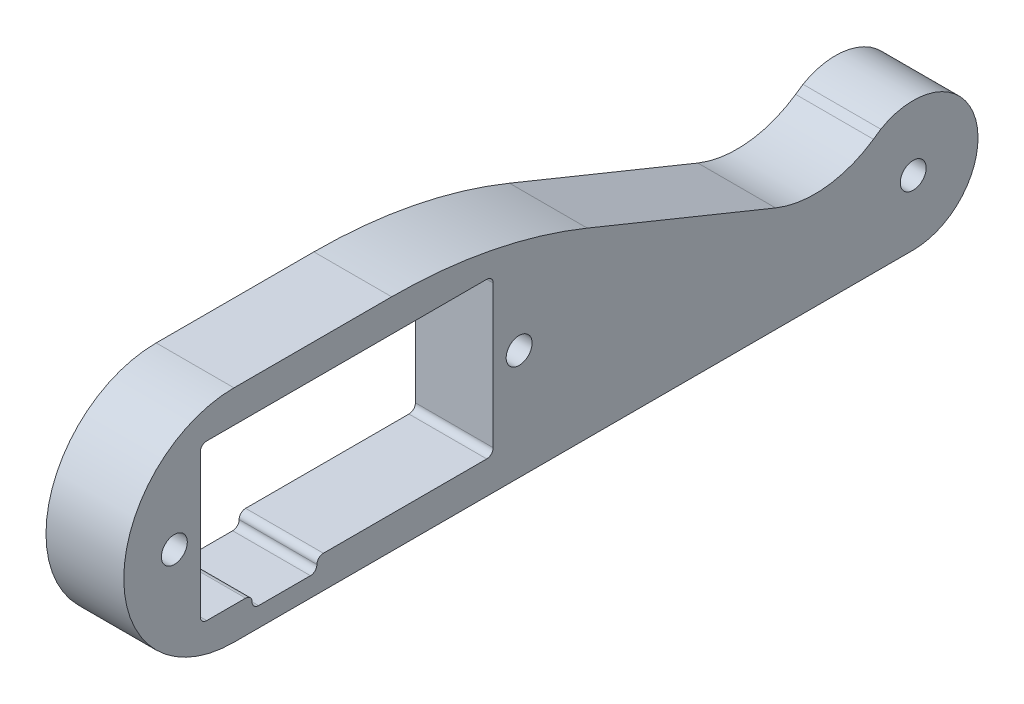
ISO-10303-21;
HEADER;
FILE_DESCRIPTION(('STEP AP214'),'2;1');
FILE_NAME('part.step','',(''),(''),'','','');
FILE_SCHEMA(('AUTOMOTIVE_DESIGN { 1 0 10303 214 1 1 1 1 }'));
ENDSEC;
DATA;
#1=APPLICATION_CONTEXT('core data for automotive mechanical design processes');
#2=APPLICATION_PROTOCOL_DEFINITION('international standard','automotive_design',2000,#1);
#3=PRODUCT_CONTEXT('',#1,'mechanical');
#4=PRODUCT('Part','Part','',(#3));
#5=PRODUCT_RELATED_PRODUCT_CATEGORY('part','',(#4));
#6=PRODUCT_DEFINITION_FORMATION('','',#4);
#7=PRODUCT_DEFINITION_CONTEXT('part definition',#1,'design');
#8=PRODUCT_DEFINITION('design','',#6,#7);
#9=PRODUCT_DEFINITION_SHAPE('','',#8);
#10=(LENGTH_UNIT() NAMED_UNIT(*) SI_UNIT(.MILLI.,.METRE.));
#11=(NAMED_UNIT(*) PLANE_ANGLE_UNIT() SI_UNIT($,.RADIAN.));
#12=(NAMED_UNIT(*) SI_UNIT($,.STERADIAN.) SOLID_ANGLE_UNIT());
#13=UNCERTAINTY_MEASURE_WITH_UNIT(LENGTH_MEASURE(1.E-05),#10,'distance_accuracy_value','');
#14=(GEOMETRIC_REPRESENTATION_CONTEXT(3) GLOBAL_UNCERTAINTY_ASSIGNED_CONTEXT((#13)) GLOBAL_UNIT_ASSIGNED_CONTEXT((#10,
#11,#12)) REPRESENTATION_CONTEXT('',''));
#15=CARTESIAN_POINT('',(0.,0.,0.));
#16=DIRECTION('',(0.,0.,1.));
#17=DIRECTION('',(1.,0.,0.));
#18=AXIS2_PLACEMENT_3D('',#15,#16,#17);
#19=CARTESIAN_POINT('',(6.,-25.5,-14.766012454293));
#20=DIRECTION('',(-1.,0.,0.));
#21=DIRECTION('',(0.,0.,1.));
#22=AXIS2_PLACEMENT_3D('',#19,#20,#21);
#23=CYLINDRICAL_SURFACE('',#22,40.);
#24=DIRECTION('',(-1.,0.,0.));
#25=VECTOR('',#24,1.);
#26=CARTESIAN_POINT('',(6.,14.5,-14.766012454293));
#27=LINE('',#26,#25);
#28=CARTESIAN_POINT('',(6.,14.5,-14.766012454293));
#29=VERTEX_POINT('',#28);
#30=CARTESIAN_POINT('',(0.,14.5,-14.766012454293));
#31=VERTEX_POINT('',#30);
#32=EDGE_CURVE('E299',#29,#31,#27,.T.);
#33=ORIENTED_EDGE('',*,*,#32,.F.);
#34=CARTESIAN_POINT('',(6.,-25.5,-14.766012454293));
#35=DIRECTION('',(1.,0.,0.));
#36=DIRECTION('',(0.,0.,-1.));
#37=AXIS2_PLACEMENT_3D('',#34,#35,#36);
#38=CIRCLE('',#37,40.);
#39=CARTESIAN_POINT('',(6.,11.5447854194722,-29.8552096902383));
#40=VERTEX_POINT('',#39);
#41=EDGE_CURVE('E305',#40,#29,#38,.T.);
#42=ORIENTED_EDGE('',*,*,#41,.F.);
#43=DIRECTION('',(-1.,0.,0.));
#44=VECTOR('',#43,1.);
#45=CARTESIAN_POINT('',(6.,11.5447854194722,-29.8552096902383));
#46=LINE('',#45,#44);
#47=CARTESIAN_POINT('',(0.,11.5447854194722,-29.8552096902383));
#48=VERTEX_POINT('',#47);
#49=EDGE_CURVE('E302',#48,#40,#46,.F.);
#50=ORIENTED_EDGE('',*,*,#49,.F.);
#51=CARTESIAN_POINT('',(0.,-25.5,-14.766012454293));
#52=DIRECTION('',(1.,0.,0.));
#53=DIRECTION('',(0.,0.,-1.));
#54=AXIS2_PLACEMENT_3D('',#51,#52,#53);
#55=CIRCLE('',#54,40.);
#56=EDGE_CURVE('E307',#31,#48,#55,.F.);
#57=ORIENTED_EDGE('',*,*,#56,.F.);
#58=EDGE_LOOP('',(#33,#42,#50,#57));
#59=FACE_BOUND('',#58,.T.);
#60=ADVANCED_FACE('F37',(#59),#23,.T.);
#61=CARTESIAN_POINT('',(6.,13.0351102224386,-47.4036076154779));
#62=DIRECTION('',(-1.,0.,0.));
#63=DIRECTION('',(0.,0.,1.));
#64=AXIS2_PLACEMENT_3D('',#61,#62,#63);
#65=CYLINDRICAL_SURFACE('',#64,8.);
#66=DIRECTION('',(1.,0.,0.));
#67=VECTOR('',#66,1.);
#68=CARTESIAN_POINT('',(6.,6.44000783465699,-51.9318108457534));
#69=LINE('',#68,#67);
#70=CARTESIAN_POINT('',(0.,6.44000783465699,-51.9318108457534));
#71=VERTEX_POINT('',#70);
#72=CARTESIAN_POINT('',(6.,6.44000783465699,-51.9318108457534));
#73=VERTEX_POINT('',#72);
#74=EDGE_CURVE('E199',#71,#73,#69,.T.);
#75=ORIENTED_EDGE('',*,*,#74,.F.);
#76=CARTESIAN_POINT('',(0.,13.0351102224386,-47.4036076154779));
#77=DIRECTION('',(1.,0.,0.));
#78=DIRECTION('',(0.,0.,-1.));
#79=AXIS2_PLACEMENT_3D('',#76,#77,#78);
#80=CIRCLE('',#79,8.);
#81=CARTESIAN_POINT('',(0.,5.62615313854414,-44.3857681682888));
#82=VERTEX_POINT('',#81);
#83=EDGE_CURVE('E294',#71,#82,#80,.F.);
#84=ORIENTED_EDGE('',*,*,#83,.T.);
#85=DIRECTION('',(1.,0.,0.));
#86=VECTOR('',#85,1.);
#87=CARTESIAN_POINT('',(6.,5.62615313854414,-44.3857681682889));
#88=LINE('',#87,#86);
#89=CARTESIAN_POINT('',(6.,5.62615313854414,-44.3857681682888));
#90=VERTEX_POINT('',#89);
#91=EDGE_CURVE('E291',#90,#82,#88,.F.);
#92=ORIENTED_EDGE('',*,*,#91,.F.);
#93=CARTESIAN_POINT('',(6.,13.0351102224386,-47.4036076154779));
#94=DIRECTION('',(1.,0.,0.));
#95=DIRECTION('',(0.,0.,-1.));
#96=AXIS2_PLACEMENT_3D('',#93,#94,#95);
#97=CIRCLE('',#96,8.);
#98=EDGE_CURVE('E297',#90,#73,#97,.T.);
#99=ORIENTED_EDGE('',*,*,#98,.T.);
#100=EDGE_LOOP('',(#75,#84,#92,#99));
#101=FACE_BOUND('',#100,.T.);
#102=ADVANCED_FACE('F453',(#101),#65,.F.);
#103=CARTESIAN_POINT('',(6.,0.,0.));
#104=DIRECTION('',(0.,1.,0.));
#105=DIRECTION('',(0.,0.,1.));
#106=AXIS2_PLACEMENT_3D('',#103,#104,#105);
#107=PLANE('',#106);
#108=DIRECTION('',(0.,0.,-1.));
#109=VECTOR('',#108,1.);
#110=CARTESIAN_POINT('',(0.,0.,0.));
#111=LINE('',#110,#109);
#112=CARTESIAN_POINT('',(0.,0.,-9.5));
#113=VERTEX_POINT('',#112);
#114=CARTESIAN_POINT('',(0.,0.,-22.1));
#115=VERTEX_POINT('',#114);
#116=EDGE_CURVE('E266',#113,#115,#111,.T.);
#117=ORIENTED_EDGE('',*,*,#116,.F.);
#118=DIRECTION('',(-1.,0.,0.));
#119=VECTOR('',#118,1.);
#120=CARTESIAN_POINT('',(6.,0.,-9.5));
#121=LINE('',#120,#119);
#122=CARTESIAN_POINT('',(6.,0.,-9.5));
#123=VERTEX_POINT('',#122);
#124=EDGE_CURVE('E330',#113,#123,#121,.F.);
#125=ORIENTED_EDGE('',*,*,#124,.T.);
#126=DIRECTION('',(0.,0.,-1.));
#127=VECTOR('',#126,1.);
#128=CARTESIAN_POINT('',(6.,0.,0.));
#129=LINE('',#128,#127);
#130=CARTESIAN_POINT('',(6.,0.,-22.1));
#131=VERTEX_POINT('',#130);
#132=EDGE_CURVE('E228',#123,#131,#129,.T.);
#133=ORIENTED_EDGE('',*,*,#132,.T.);
#134=DIRECTION('',(-1.,0.,0.));
#135=VECTOR('',#134,1.);
#136=CARTESIAN_POINT('',(6.,0.,-22.1));
#137=LINE('',#136,#135);
#138=EDGE_CURVE('E327',#131,#115,#137,.T.);
#139=ORIENTED_EDGE('',*,*,#138,.T.);
#140=EDGE_LOOP('',(#117,#125,#133,#139));
#141=FACE_BOUND('',#140,.T.);
#142=ADVANCED_FACE('F387',(#141),#107,.T.);
#143=CARTESIAN_POINT('',(6.,-1.,0.));
#144=DIRECTION('',(0.,1.,0.));
#145=DIRECTION('',(0.,0.,1.));
#146=AXIS2_PLACEMENT_3D('',#143,#144,#145);
#147=PLANE('',#146);
#148=DIRECTION('',(0.,0.,-1.));
#149=VECTOR('',#148,1.);
#150=CARTESIAN_POINT('',(0.,-1.,0.));
#151=LINE('',#150,#149);
#152=CARTESIAN_POINT('',(0.,-1.,-4.5));
#153=VERTEX_POINT('',#152);
#154=CARTESIAN_POINT('',(0.,-1.,-8.5));
#155=VERTEX_POINT('',#154);
#156=EDGE_CURVE('E269',#153,#155,#151,.T.);
#157=ORIENTED_EDGE('',*,*,#156,.F.);
#158=DIRECTION('',(-1.,0.,0.));
#159=VECTOR('',#158,1.);
#160=CARTESIAN_POINT('',(6.,-1.,-4.5));
#161=LINE('',#160,#159);
#162=CARTESIAN_POINT('',(6.,-1.,-4.5));
#163=VERTEX_POINT('',#162);
#164=EDGE_CURVE('E325',#153,#163,#161,.F.);
#165=ORIENTED_EDGE('',*,*,#164,.T.);
#166=DIRECTION('',(0.,0.,-1.));
#167=VECTOR('',#166,1.);
#168=CARTESIAN_POINT('',(6.,-1.,0.));
#169=LINE('',#168,#167);
#170=CARTESIAN_POINT('',(6.,-1.,-8.5));
#171=VERTEX_POINT('',#170);
#172=EDGE_CURVE('E231',#163,#171,#169,.T.);
#173=ORIENTED_EDGE('',*,*,#172,.T.);
#174=DIRECTION('',(-1.,0.,0.));
#175=VECTOR('',#174,1.);
#176=CARTESIAN_POINT('',(6.,-1.,-8.5));
#177=LINE('',#176,#175);
#178=EDGE_CURVE('E322',#171,#155,#177,.T.);
#179=ORIENTED_EDGE('',*,*,#178,.T.);
#180=EDGE_LOOP('',(#157,#165,#173,#179));
#181=FACE_BOUND('',#180,.T.);
#182=ADVANCED_FACE('F431',(#181),#147,.T.);
#183=CARTESIAN_POINT('',(6.,0.,-0.5));
#184=VERTEX_POINT('',#183);
#185=CARTESIAN_POINT('',(6.,0.,-3.5));
#186=VERTEX_POINT('',#185);
#187=EDGE_CURVE('E232',#184,#186,#129,.T.);
#188=ORIENTED_EDGE('',*,*,#187,.T.);
#189=DIRECTION('',(-1.,0.,0.));
#190=VECTOR('',#189,1.);
#191=CARTESIAN_POINT('',(6.,0.,-3.5));
#192=LINE('',#191,#190);
#193=CARTESIAN_POINT('',(0.,0.,-3.5));
#194=VERTEX_POINT('',#193);
#195=EDGE_CURVE('E311',#186,#194,#192,.T.);
#196=ORIENTED_EDGE('',*,*,#195,.T.);
#197=CARTESIAN_POINT('',(0.,0.,-0.5));
#198=VERTEX_POINT('',#197);
#199=EDGE_CURVE('E270',#198,#194,#111,.T.);
#200=ORIENTED_EDGE('',*,*,#199,.F.);
#201=DIRECTION('',(-1.,0.,0.));
#202=VECTOR('',#201,1.);
#203=CARTESIAN_POINT('',(6.,0.,-0.5));
#204=LINE('',#203,#202);
#205=EDGE_CURVE('E309',#198,#184,#204,.F.);
#206=ORIENTED_EDGE('',*,*,#205,.T.);
#207=EDGE_LOOP('',(#188,#196,#200,#206));
#208=FACE_BOUND('',#207,.T.);
#209=ADVANCED_FACE('F419',(#208),#107,.T.);
#210=CARTESIAN_POINT('',(6.,0.,0.));
#211=DIRECTION('',(0.,0.,-1.));
#212=DIRECTION('',(-1.,0.,0.));
#213=AXIS2_PLACEMENT_3D('',#210,#211,#212);
#214=PLANE('',#213);
#215=DIRECTION('',(0.,-1.,0.));
#216=VECTOR('',#215,1.);
#217=CARTESIAN_POINT('',(6.,0.,0.));
#218=LINE('',#217,#216);
#219=CARTESIAN_POINT('',(6.,11.5,0.));
#220=VERTEX_POINT('',#219);
#221=CARTESIAN_POINT('',(6.,0.5,0.));
#222=VERTEX_POINT('',#221);
#223=EDGE_CURVE('E235',#220,#222,#218,.T.);
#224=ORIENTED_EDGE('',*,*,#223,.T.);
#225=DIRECTION('',(-1.,0.,0.));
#226=VECTOR('',#225,1.);
#227=CARTESIAN_POINT('',(0.,0.5,0.));
#228=LINE('',#227,#226);
#229=CARTESIAN_POINT('',(0.,0.5,0.));
#230=VERTEX_POINT('',#229);
#231=EDGE_CURVE('E338',#222,#230,#228,.T.);
#232=ORIENTED_EDGE('',*,*,#231,.T.);
#233=DIRECTION('',(0.,-1.,0.));
#234=VECTOR('',#233,1.);
#235=CARTESIAN_POINT('',(0.,0.,0.));
#236=LINE('',#235,#234);
#237=CARTESIAN_POINT('',(0.,11.5,0.));
#238=VERTEX_POINT('',#237);
#239=EDGE_CURVE('E273',#238,#230,#236,.T.);
#240=ORIENTED_EDGE('',*,*,#239,.F.);
#241=DIRECTION('',(-1.,0.,0.));
#242=VECTOR('',#241,1.);
#243=CARTESIAN_POINT('',(6.,11.5,0.));
#244=LINE('',#243,#242);
#245=EDGE_CURVE('E336',#238,#220,#244,.F.);
#246=ORIENTED_EDGE('',*,*,#245,.T.);
#247=EDGE_LOOP('',(#224,#232,#240,#246));
#248=FACE_BOUND('',#247,.T.);
#249=ADVANCED_FACE('F409',(#248),#214,.T.);
#250=CARTESIAN_POINT('',(6.,12.,0.));
#251=DIRECTION('',(0.,1.,0.));
#252=DIRECTION('',(0.,0.,1.));
#253=AXIS2_PLACEMENT_3D('',#250,#251,#252);
#254=PLANE('',#253);
#255=DIRECTION('',(0.,0.,-1.));
#256=VECTOR('',#255,1.);
#257=CARTESIAN_POINT('',(6.,12.,0.));
#258=LINE('',#257,#256);
#259=CARTESIAN_POINT('',(6.,12.,-0.5));
#260=VERTEX_POINT('',#259);
#261=CARTESIAN_POINT('',(6.,12.,-22.1));
#262=VERTEX_POINT('',#261);
#263=EDGE_CURVE('E238',#260,#262,#258,.T.);
#264=ORIENTED_EDGE('',*,*,#263,.F.);
#265=DIRECTION('',(-1.,0.,0.));
#266=VECTOR('',#265,1.);
#267=CARTESIAN_POINT('',(6.,12.,-0.5));
#268=LINE('',#267,#266);
#269=CARTESIAN_POINT('',(0.,12.,-0.5));
#270=VERTEX_POINT('',#269);
#271=EDGE_CURVE('E343',#260,#270,#268,.T.);
#272=ORIENTED_EDGE('',*,*,#271,.T.);
#273=DIRECTION('',(0.,0.,-1.));
#274=VECTOR('',#273,1.);
#275=CARTESIAN_POINT('',(0.,12.,0.));
#276=LINE('',#275,#274);
#277=CARTESIAN_POINT('',(0.,12.,-22.1));
#278=VERTEX_POINT('',#277);
#279=EDGE_CURVE('E276',#270,#278,#276,.T.);
#280=ORIENTED_EDGE('',*,*,#279,.T.);
#281=DIRECTION('',(-1.,0.,0.));
#282=VECTOR('',#281,1.);
#283=CARTESIAN_POINT('',(6.,12.,-22.1));
#284=LINE('',#283,#282);
#285=EDGE_CURVE('E341',#278,#262,#284,.F.);
#286=ORIENTED_EDGE('',*,*,#285,.T.);
#287=EDGE_LOOP('',(#264,#272,#280,#286));
#288=FACE_BOUND('',#287,.T.);
#289=ADVANCED_FACE('F401',(#288),#254,.F.);
#290=CARTESIAN_POINT('',(6.,6.,-2.6));
#291=DIRECTION('',(-1.,0.,0.));
#292=DIRECTION('',(0.,0.,1.));
#293=AXIS2_PLACEMENT_3D('',#290,#291,#292);
#294=CYLINDRICAL_SURFACE('',#293,8.5);
#295=CARTESIAN_POINT('',(0.,6.,-2.6));
#296=DIRECTION('',(1.,0.,0.));
#297=DIRECTION('',(0.,0.,-1.));
#298=AXIS2_PLACEMENT_3D('',#295,#296,#297);
#299=CIRCLE('',#298,8.5);
#300=CARTESIAN_POINT('',(0.,-2.5,-2.6));
#301=VERTEX_POINT('',#300);
#302=CARTESIAN_POINT('',(0.,14.5,-2.6));
#303=VERTEX_POINT('',#302);
#304=EDGE_CURVE('E195',#301,#303,#299,.F.);
#305=ORIENTED_EDGE('',*,*,#304,.F.);
#306=DIRECTION('',(-1.,0.,0.));
#307=VECTOR('',#306,1.);
#308=CARTESIAN_POINT('',(6.,-2.5,-2.6));
#309=LINE('',#308,#307);
#310=CARTESIAN_POINT('',(6.,-2.5,-2.6));
#311=VERTEX_POINT('',#310);
#312=EDGE_CURVE('E188',#311,#301,#309,.T.);
#313=ORIENTED_EDGE('',*,*,#312,.F.);
#314=CARTESIAN_POINT('',(6.,6.,-2.6));
#315=DIRECTION('',(1.,0.,0.));
#316=DIRECTION('',(0.,0.,-1.));
#317=AXIS2_PLACEMENT_3D('',#314,#315,#316);
#318=CIRCLE('',#317,8.5);
#319=CARTESIAN_POINT('',(6.,14.5,-2.6));
#320=VERTEX_POINT('',#319);
#321=EDGE_CURVE('E192',#311,#320,#318,.F.);
#322=ORIENTED_EDGE('',*,*,#321,.T.);
#323=DIRECTION('',(-1.,0.,0.));
#324=VECTOR('',#323,1.);
#325=CARTESIAN_POINT('',(6.,14.5,-2.6));
#326=LINE('',#325,#324);
#327=EDGE_CURVE('E245',#320,#303,#326,.T.);
#328=ORIENTED_EDGE('',*,*,#327,.T.);
#329=EDGE_LOOP('',(#305,#313,#322,#328));
#330=FACE_BOUND('',#329,.T.);
#331=ADVANCED_FACE('F190',(#330),#294,.T.);
#332=CARTESIAN_POINT('',(6.,-2.5,0.));
#333=DIRECTION('',(0.,1.,0.));
#334=DIRECTION('',(0.,0.,1.));
#335=AXIS2_PLACEMENT_3D('',#332,#333,#334);
#336=PLANE('',#335);
#337=DIRECTION('',(0.,0.,-1.));
#338=VECTOR('',#337,1.);
#339=CARTESIAN_POINT('',(0.,-2.5,0.));
#340=LINE('',#339,#338);
#341=CARTESIAN_POINT('',(0.,-2.49999999999999,-55.));
#342=VERTEX_POINT('',#341);
#343=EDGE_CURVE('E254',#301,#342,#340,.T.);
#344=ORIENTED_EDGE('',*,*,#343,.T.);
#345=DIRECTION('',(-1.,0.,0.));
#346=VECTOR('',#345,1.);
#347=CARTESIAN_POINT('',(6.,-2.49999999999999,-55.));
#348=LINE('',#347,#346);
#349=CARTESIAN_POINT('',(6.,-2.49999999999999,-55.));
#350=VERTEX_POINT('',#349);
#351=EDGE_CURVE('E200',#350,#342,#348,.T.);
#352=ORIENTED_EDGE('',*,*,#351,.F.);
#353=DIRECTION('',(0.,0.,-1.));
#354=VECTOR('',#353,1.);
#355=CARTESIAN_POINT('',(6.,-2.5,0.));
#356=LINE('',#355,#354);
#357=EDGE_CURVE('E204',#311,#350,#356,.T.);
#358=ORIENTED_EDGE('',*,*,#357,.F.);
#359=ORIENTED_EDGE('',*,*,#312,.T.);
#360=EDGE_LOOP('',(#344,#352,#358,#359));
#361=FACE_BOUND('',#360,.T.);
#362=ADVANCED_FACE('F205',(#361),#336,.F.);
#363=CARTESIAN_POINT('',(6.,2.5,-55.));
#364=DIRECTION('',(-1.,0.,0.));
#365=DIRECTION('',(0.,0.,1.));
#366=AXIS2_PLACEMENT_3D('',#363,#364,#365);
#367=CYLINDRICAL_SURFACE('',#366,4.99999999999999);
#368=CARTESIAN_POINT('',(0.,2.5,-55.));
#369=DIRECTION('',(1.,0.,0.));
#370=DIRECTION('',(0.,0.,-1.));
#371=AXIS2_PLACEMENT_3D('',#368,#369,#370);
#372=CIRCLE('',#371,4.99999999999999);
#373=CARTESIAN_POINT('',(0.,6.83012701892219,-52.5));
#374=VERTEX_POINT('',#373);
#375=EDGE_CURVE('E256',#342,#374,#372,.T.);
#376=ORIENTED_EDGE('',*,*,#375,.T.);
#377=DIRECTION('',(-1.,0.,0.));
#378=VECTOR('',#377,1.);
#379=CARTESIAN_POINT('',(6.,6.83012701892219,-52.5));
#380=LINE('',#379,#378);
#381=CARTESIAN_POINT('',(6.,6.83012701892219,-52.5));
#382=VERTEX_POINT('',#381);
#383=EDGE_CURVE('E285',#382,#374,#380,.T.);
#384=ORIENTED_EDGE('',*,*,#383,.F.);
#385=CARTESIAN_POINT('',(6.,2.5,-55.));
#386=DIRECTION('',(1.,0.,0.));
#387=DIRECTION('',(0.,0.,-1.));
#388=AXIS2_PLACEMENT_3D('',#385,#386,#387);
#389=CIRCLE('',#388,4.99999999999999);
#390=EDGE_CURVE('E209',#350,#382,#389,.T.);
#391=ORIENTED_EDGE('',*,*,#390,.F.);
#392=ORIENTED_EDGE('',*,*,#351,.T.);
#393=EDGE_LOOP('',(#376,#384,#391,#392));
#394=FACE_BOUND('',#393,.T.);
#395=ADVANCED_FACE('F618',(#394),#367,.T.);
#396=CARTESIAN_POINT('',(6.,-19.8559244878332,-13.6330956093248));
#397=DIRECTION('',(0.,0.824387798472699,0.566025403784438));
#398=DIRECTION('',(0.,-0.566025403784438,0.824387798472699));
#399=AXIS2_PLACEMENT_3D('',#396,#397,#398);
#400=PLANE('',#399);
#401=DIRECTION('',(0.,0.566025403784438,-0.824387798472699));
#402=VECTOR('',#401,1.);
#403=CARTESIAN_POINT('',(0.,-19.8559244878332,-13.6330956093248));
#404=LINE('',#403,#402);
#405=EDGE_CURVE('E259',#71,#374,#404,.T.);
#406=ORIENTED_EDGE('',*,*,#405,.F.);
#407=ORIENTED_EDGE('',*,*,#74,.T.);
#408=DIRECTION('',(0.,0.566025403784438,-0.824387798472699));
#409=VECTOR('',#408,1.);
#410=CARTESIAN_POINT('',(6.,-19.8559244878332,-13.6330956093248));
#411=LINE('',#410,#409);
#412=EDGE_CURVE('E223',#73,#382,#411,.T.);
#413=ORIENTED_EDGE('',*,*,#412,.T.);
#414=ORIENTED_EDGE('',*,*,#383,.T.);
#415=EDGE_LOOP('',(#406,#407,#413,#414));
#416=FACE_BOUND('',#415,.T.);
#417=ADVANCED_FACE('F604',(#416),#400,.T.);
#418=CARTESIAN_POINT('',(6.,20.3321519407234,-8.28175537773583));
#419=DIRECTION('',(0.,0.926119635486805,-0.377229930898633));
#420=DIRECTION('',(0.,0.377229930898633,0.926119635486805));
#421=AXIS2_PLACEMENT_3D('',#418,#419,#420);
#422=PLANE('',#421);
#423=DIRECTION('',(0.,-0.377229930898633,-0.926119635486805));
#424=VECTOR('',#423,1.);
#425=CARTESIAN_POINT('',(0.,20.3321519407234,-8.28175537773583));
#426=LINE('',#425,#424);
#427=EDGE_CURVE('E261',#48,#82,#426,.T.);
#428=ORIENTED_EDGE('',*,*,#427,.F.);
#429=ORIENTED_EDGE('',*,*,#49,.T.);
#430=DIRECTION('',(0.,-0.377229930898633,-0.926119635486805));
#431=VECTOR('',#430,1.);
#432=CARTESIAN_POINT('',(6.,20.3321519407234,-8.28175537773583));
#433=LINE('',#432,#431);
#434=EDGE_CURVE('E225',#40,#90,#433,.T.);
#435=ORIENTED_EDGE('',*,*,#434,.T.);
#436=ORIENTED_EDGE('',*,*,#91,.T.);
#437=EDGE_LOOP('',(#428,#429,#435,#436));
#438=FACE_BOUND('',#437,.T.);
#439=ADVANCED_FACE('F543',(#438),#422,.T.);
#440=CARTESIAN_POINT('',(6.,0.,-22.6));
#441=DIRECTION('',(0.,0.,-1.));
#442=DIRECTION('',(-1.,0.,0.));
#443=AXIS2_PLACEMENT_3D('',#440,#441,#442);
#444=PLANE('',#443);
#445=DIRECTION('',(0.,-1.,0.));
#446=VECTOR('',#445,1.);
#447=CARTESIAN_POINT('',(0.,0.,-22.6));
#448=LINE('',#447,#446);
#449=CARTESIAN_POINT('',(0.,11.5,-22.6));
#450=VERTEX_POINT('',#449);
#451=CARTESIAN_POINT('',(0.,0.5,-22.6));
#452=VERTEX_POINT('',#451);
#453=EDGE_CURVE('E279',#450,#452,#448,.T.);
#454=ORIENTED_EDGE('',*,*,#453,.T.);
#455=DIRECTION('',(-1.,0.,0.));
#456=VECTOR('',#455,1.);
#457=CARTESIAN_POINT('',(6.,0.5,-22.6));
#458=LINE('',#457,#456);
#459=CARTESIAN_POINT('',(6.,0.5,-22.6));
#460=VERTEX_POINT('',#459);
#461=EDGE_CURVE('E54',#452,#460,#458,.F.);
#462=ORIENTED_EDGE('',*,*,#461,.T.);
#463=DIRECTION('',(0.,-1.,0.));
#464=VECTOR('',#463,1.);
#465=CARTESIAN_POINT('',(6.,0.,-22.6));
#466=LINE('',#465,#464);
#467=CARTESIAN_POINT('',(6.,11.5,-22.6));
#468=VERTEX_POINT('',#467);
#469=EDGE_CURVE('E240',#468,#460,#466,.T.);
#470=ORIENTED_EDGE('',*,*,#469,.F.);
#471=DIRECTION('',(-1.,0.,0.));
#472=VECTOR('',#471,1.);
#473=CARTESIAN_POINT('',(0.,11.5,-22.6));
#474=LINE('',#473,#472);
#475=EDGE_CURVE('E332',#468,#450,#474,.T.);
#476=ORIENTED_EDGE('',*,*,#475,.T.);
#477=EDGE_LOOP('',(#454,#462,#470,#476));
#478=FACE_BOUND('',#477,.T.);
#479=ADVANCED_FACE('F394',(#478),#444,.F.);
#480=CARTESIAN_POINT('',(6.,14.5,0.));
#481=DIRECTION('',(0.,1.,0.));
#482=DIRECTION('',(0.,0.,1.));
#483=AXIS2_PLACEMENT_3D('',#480,#481,#482);
#484=PLANE('',#483);
#485=DIRECTION('',(0.,0.,-1.));
#486=VECTOR('',#485,1.);
#487=CARTESIAN_POINT('',(6.,14.5,0.));
#488=LINE('',#487,#486);
#489=EDGE_CURVE('E214',#320,#29,#488,.T.);
#490=ORIENTED_EDGE('',*,*,#489,.T.);
#491=ORIENTED_EDGE('',*,*,#32,.T.);
#492=DIRECTION('',(0.,0.,-1.));
#493=VECTOR('',#492,1.);
#494=CARTESIAN_POINT('',(0.,14.5,0.));
#495=LINE('',#494,#493);
#496=EDGE_CURVE('E263',#303,#31,#495,.T.);
#497=ORIENTED_EDGE('',*,*,#496,.F.);
#498=ORIENTED_EDGE('',*,*,#327,.F.);
#499=EDGE_LOOP('',(#490,#491,#497,#498));
#500=FACE_BOUND('',#499,.T.);
#501=ADVANCED_FACE('F542',(#500),#484,.T.);
#502=CARTESIAN_POINT('',(6.,6.,-24.6));
#503=DIRECTION('',(-1.,0.,0.));
#504=DIRECTION('',(0.,0.,1.));
#505=AXIS2_PLACEMENT_3D('',#502,#503,#504);
#506=CYLINDRICAL_SURFACE('',#505,1.);
#507=CARTESIAN_POINT('',(6.,6.,-24.6));
#508=DIRECTION('',(1.,0.,0.));
#509=DIRECTION('',(0.,0.,-1.));
#510=AXIS2_PLACEMENT_3D('',#507,#508,#509);
#511=CIRCLE('',#510,1.);
#512=CARTESIAN_POINT('',(6.,6.,-25.6));
#513=VERTEX_POINT('',#512);
#514=EDGE_CURVE('E215',#513,#513,#511,.T.);
#515=ORIENTED_EDGE('',*,*,#514,.T.);
#516=EDGE_LOOP('',(#515));
#517=FACE_BOUND('',#516,.T.);
#518=CARTESIAN_POINT('',(0.,6.,-24.6));
#519=DIRECTION('',(1.,0.,0.));
#520=DIRECTION('',(0.,0.,-1.));
#521=AXIS2_PLACEMENT_3D('',#518,#519,#520);
#522=CIRCLE('',#521,1.);
#523=CARTESIAN_POINT('',(0.,6.,-25.6));
#524=VERTEX_POINT('',#523);
#525=EDGE_CURVE('E249',#524,#524,#522,.T.);
#526=ORIENTED_EDGE('',*,*,#525,.F.);
#527=EDGE_LOOP('',(#526));
#528=FACE_BOUND('',#527,.T.);
#529=ADVANCED_FACE('F595',(#517,#528),#506,.F.);
#530=CARTESIAN_POINT('',(6.,6.,2.));
#531=DIRECTION('',(-1.,0.,0.));
#532=DIRECTION('',(0.,0.,1.));
#533=AXIS2_PLACEMENT_3D('',#530,#531,#532);
#534=CYLINDRICAL_SURFACE('',#533,1.);
#535=CARTESIAN_POINT('',(6.,6.,2.));
#536=DIRECTION('',(1.,0.,0.));
#537=DIRECTION('',(0.,0.,-1.));
#538=AXIS2_PLACEMENT_3D('',#535,#536,#537);
#539=CIRCLE('',#538,1.);
#540=CARTESIAN_POINT('',(6.,6.,0.999999999999999));
#541=VERTEX_POINT('',#540);
#542=EDGE_CURVE('E218',#541,#541,#539,.T.);
#543=ORIENTED_EDGE('',*,*,#542,.T.);
#544=EDGE_LOOP('',(#543));
#545=FACE_BOUND('',#544,.T.);
#546=CARTESIAN_POINT('',(0.,6.,2.));
#547=DIRECTION('',(1.,0.,0.));
#548=DIRECTION('',(0.,0.,-1.));
#549=AXIS2_PLACEMENT_3D('',#546,#547,#548);
#550=CIRCLE('',#549,1.);
#551=CARTESIAN_POINT('',(0.,6.,0.999999999999999));
#552=VERTEX_POINT('',#551);
#553=EDGE_CURVE('E246',#552,#552,#550,.T.);
#554=ORIENTED_EDGE('',*,*,#553,.F.);
#555=EDGE_LOOP('',(#554));
#556=FACE_BOUND('',#555,.T.);
#557=ADVANCED_FACE('F441',(#545,#556),#534,.F.);
#558=CARTESIAN_POINT('',(6.,2.5,-55.));
#559=DIRECTION('',(-1.,0.,0.));
#560=DIRECTION('',(0.,0.,1.));
#561=AXIS2_PLACEMENT_3D('',#558,#559,#560);
#562=CYLINDRICAL_SURFACE('',#561,0.999999999999998);
#563=CARTESIAN_POINT('',(6.,2.5,-55.));
#564=DIRECTION('',(1.,0.,0.));
#565=DIRECTION('',(0.,0.,-1.));
#566=AXIS2_PLACEMENT_3D('',#563,#564,#565);
#567=CIRCLE('',#566,0.999999999999998);
#568=CARTESIAN_POINT('',(6.,2.5,-56.));
#569=VERTEX_POINT('',#568);
#570=EDGE_CURVE('E242',#569,#569,#567,.T.);
#571=ORIENTED_EDGE('',*,*,#570,.T.);
#572=EDGE_LOOP('',(#571));
#573=FACE_BOUND('',#572,.T.);
#574=CARTESIAN_POINT('',(0.,2.5,-55.));
#575=DIRECTION('',(1.,0.,0.));
#576=DIRECTION('',(0.,0.,-1.));
#577=AXIS2_PLACEMENT_3D('',#574,#575,#576);
#578=CIRCLE('',#577,0.999999999999998);
#579=CARTESIAN_POINT('',(0.,2.5,-56.));
#580=VERTEX_POINT('',#579);
#581=EDGE_CURVE('E281',#580,#580,#578,.T.);
#582=ORIENTED_EDGE('',*,*,#581,.F.);
#583=EDGE_LOOP('',(#582));
#584=FACE_BOUND('',#583,.T.);
#585=ADVANCED_FACE('F434',(#573,#584),#562,.F.);
#586=CARTESIAN_POINT('',(6.,0.,0.));
#587=DIRECTION('',(1.,0.,0.));
#588=DIRECTION('',(0.,0.,-1.));
#589=AXIS2_PLACEMENT_3D('',#586,#587,#588);
#590=PLANE('',#589);
#591=ORIENTED_EDGE('',*,*,#542,.F.);
#592=EDGE_LOOP('',(#591));
#593=FACE_BOUND('',#592,.T.);
#594=ORIENTED_EDGE('',*,*,#514,.F.);
#595=EDGE_LOOP('',(#594));
#596=FACE_BOUND('',#595,.T.);
#597=ORIENTED_EDGE('',*,*,#434,.F.);
#598=ORIENTED_EDGE('',*,*,#41,.T.);
#599=ORIENTED_EDGE('',*,*,#489,.F.);
#600=ORIENTED_EDGE('',*,*,#321,.F.);
#601=ORIENTED_EDGE('',*,*,#357,.T.);
#602=ORIENTED_EDGE('',*,*,#390,.T.);
#603=ORIENTED_EDGE('',*,*,#412,.F.);
#604=ORIENTED_EDGE('',*,*,#98,.F.);
#605=EDGE_LOOP('',(#597,#598,#599,#600,#601,#602,#603,#604));
#606=FACE_BOUND('',#605,.T.);
#607=ORIENTED_EDGE('',*,*,#172,.F.);
#608=CARTESIAN_POINT('',(6.,-0.5,-4.5));
#609=DIRECTION('',(1.,0.,0.));
#610=DIRECTION('',(0.,0.,-1.));
#611=AXIS2_PLACEMENT_3D('',#608,#609,#610);
#612=CIRCLE('',#611,0.5);
#613=CARTESIAN_POINT('',(6.,-0.5,-4.));
#614=VERTEX_POINT('',#613);
#615=EDGE_CURVE('E348',#163,#614,#612,.F.);
#616=ORIENTED_EDGE('',*,*,#615,.T.);
#617=CARTESIAN_POINT('',(6.,-0.5,-3.5));
#618=DIRECTION('',(1.,0.,0.));
#619=DIRECTION('',(0.,0.,-1.));
#620=AXIS2_PLACEMENT_3D('',#617,#618,#619);
#621=CIRCLE('',#620,0.5);
#622=EDGE_CURVE('E320',#614,#186,#621,.T.);
#623=ORIENTED_EDGE('',*,*,#622,.T.);
#624=ORIENTED_EDGE('',*,*,#187,.F.);
#625=CARTESIAN_POINT('',(6.,0.5,-0.5));
#626=DIRECTION('',(1.,0.,0.));
#627=DIRECTION('',(0.,0.,-1.));
#628=AXIS2_PLACEMENT_3D('',#625,#626,#627);
#629=CIRCLE('',#628,0.5);
#630=EDGE_CURVE('E360',#184,#222,#629,.F.);
#631=ORIENTED_EDGE('',*,*,#630,.T.);
#632=ORIENTED_EDGE('',*,*,#223,.F.);
#633=CARTESIAN_POINT('',(6.,11.5,-0.5));
#634=DIRECTION('',(1.,0.,0.));
#635=DIRECTION('',(0.,0.,-1.));
#636=AXIS2_PLACEMENT_3D('',#633,#634,#635);
#637=CIRCLE('',#636,0.5);
#638=EDGE_CURVE('E364',#220,#260,#637,.F.);
#639=ORIENTED_EDGE('',*,*,#638,.T.);
#640=ORIENTED_EDGE('',*,*,#263,.T.);
#641=CARTESIAN_POINT('',(6.,11.5,-22.1));
#642=DIRECTION('',(1.,0.,0.));
#643=DIRECTION('',(0.,0.,-1.));
#644=AXIS2_PLACEMENT_3D('',#641,#642,#643);
#645=CIRCLE('',#644,0.5);
#646=EDGE_CURVE('E11',#262,#468,#645,.F.);
#647=ORIENTED_EDGE('',*,*,#646,.T.);
#648=ORIENTED_EDGE('',*,*,#469,.T.);
#649=CARTESIAN_POINT('',(6.,0.5,-22.1));
#650=DIRECTION('',(1.,0.,0.));
#651=DIRECTION('',(0.,0.,-1.));
#652=AXIS2_PLACEMENT_3D('',#649,#650,#651);
#653=CIRCLE('',#652,0.5);
#654=EDGE_CURVE('E356',#460,#131,#653,.F.);
#655=ORIENTED_EDGE('',*,*,#654,.T.);
#656=ORIENTED_EDGE('',*,*,#132,.F.);
#657=CARTESIAN_POINT('',(6.,-0.5,-9.5));
#658=DIRECTION('',(1.,0.,0.));
#659=DIRECTION('',(0.,0.,-1.));
#660=AXIS2_PLACEMENT_3D('',#657,#658,#659);
#661=CIRCLE('',#660,0.5);
#662=CARTESIAN_POINT('',(6.,-0.5,-9.));
#663=VERTEX_POINT('',#662);
#664=EDGE_CURVE('E318',#123,#663,#661,.T.);
#665=ORIENTED_EDGE('',*,*,#664,.T.);
#666=CARTESIAN_POINT('',(6.,-0.5,-8.5));
#667=DIRECTION('',(1.,0.,0.));
#668=DIRECTION('',(0.,0.,-1.));
#669=AXIS2_PLACEMENT_3D('',#666,#667,#668);
#670=CIRCLE('',#669,0.5);
#671=EDGE_CURVE('E352',#663,#171,#670,.F.);
#672=ORIENTED_EDGE('',*,*,#671,.T.);
#673=EDGE_LOOP('',(#607,#616,#623,#624,#631,#632,#639,#640,#647,#648,#655,#656,#665,#672));
#674=FACE_BOUND('',#673,.T.);
#675=ORIENTED_EDGE('',*,*,#570,.F.);
#676=EDGE_LOOP('',(#675));
#677=FACE_BOUND('',#676,.T.);
#678=ADVANCED_FACE('F212',(#593,#596,#606,#674,#677),#590,.T.);
#679=CARTESIAN_POINT('',(0.,0.,0.));
#680=DIRECTION('',(1.,0.,0.));
#681=DIRECTION('',(0.,0.,-1.));
#682=AXIS2_PLACEMENT_3D('',#679,#680,#681);
#683=PLANE('',#682);
#684=ORIENTED_EDGE('',*,*,#496,.T.);
#685=ORIENTED_EDGE('',*,*,#56,.T.);
#686=ORIENTED_EDGE('',*,*,#427,.T.);
#687=ORIENTED_EDGE('',*,*,#83,.F.);
#688=ORIENTED_EDGE('',*,*,#405,.T.);
#689=ORIENTED_EDGE('',*,*,#375,.F.);
#690=ORIENTED_EDGE('',*,*,#343,.F.);
#691=ORIENTED_EDGE('',*,*,#304,.T.);
#692=EDGE_LOOP('',(#684,#685,#686,#687,#688,#689,#690,#691));
#693=FACE_BOUND('',#692,.T.);
#694=ORIENTED_EDGE('',*,*,#553,.T.);
#695=EDGE_LOOP('',(#694));
#696=FACE_BOUND('',#695,.T.);
#697=ORIENTED_EDGE('',*,*,#525,.T.);
#698=EDGE_LOOP('',(#697));
#699=FACE_BOUND('',#698,.T.);
#700=ORIENTED_EDGE('',*,*,#199,.T.);
#701=CARTESIAN_POINT('',(0.,-0.5,-3.5));
#702=DIRECTION('',(1.,0.,0.));
#703=DIRECTION('',(0.,0.,-1.));
#704=AXIS2_PLACEMENT_3D('',#701,#702,#703);
#705=CIRCLE('',#704,0.5);
#706=CARTESIAN_POINT('',(0.,-0.5,-4.));
#707=VERTEX_POINT('',#706);
#708=EDGE_CURVE('E316',#194,#707,#705,.F.);
#709=ORIENTED_EDGE('',*,*,#708,.T.);
#710=CARTESIAN_POINT('',(0.,-0.5,-4.5));
#711=DIRECTION('',(1.,0.,0.));
#712=DIRECTION('',(0.,0.,-1.));
#713=AXIS2_PLACEMENT_3D('',#710,#711,#712);
#714=CIRCLE('',#713,0.5);
#715=EDGE_CURVE('E346',#707,#153,#714,.T.);
#716=ORIENTED_EDGE('',*,*,#715,.T.);
#717=ORIENTED_EDGE('',*,*,#156,.T.);
#718=CARTESIAN_POINT('',(0.,-0.5,-8.5));
#719=DIRECTION('',(1.,0.,0.));
#720=DIRECTION('',(0.,0.,-1.));
#721=AXIS2_PLACEMENT_3D('',#718,#719,#720);
#722=CIRCLE('',#721,0.5);
#723=CARTESIAN_POINT('',(0.,-0.5,-9.));
#724=VERTEX_POINT('',#723);
#725=EDGE_CURVE('E350',#155,#724,#722,.T.);
#726=ORIENTED_EDGE('',*,*,#725,.T.);
#727=CARTESIAN_POINT('',(0.,-0.5,-9.5));
#728=DIRECTION('',(1.,0.,0.));
#729=DIRECTION('',(0.,0.,-1.));
#730=AXIS2_PLACEMENT_3D('',#727,#728,#729);
#731=CIRCLE('',#730,0.5);
#732=EDGE_CURVE('E314',#724,#113,#731,.F.);
#733=ORIENTED_EDGE('',*,*,#732,.T.);
#734=ORIENTED_EDGE('',*,*,#116,.T.);
#735=CARTESIAN_POINT('',(0.,0.5,-22.1));
#736=DIRECTION('',(1.,0.,0.));
#737=DIRECTION('',(0.,0.,-1.));
#738=AXIS2_PLACEMENT_3D('',#735,#736,#737);
#739=CIRCLE('',#738,0.5);
#740=EDGE_CURVE('E354',#115,#452,#739,.T.);
#741=ORIENTED_EDGE('',*,*,#740,.T.);
#742=ORIENTED_EDGE('',*,*,#453,.F.);
#743=CARTESIAN_POINT('',(0.,11.5,-22.1));
#744=DIRECTION('',(1.,0.,0.));
#745=DIRECTION('',(0.,0.,-1.));
#746=AXIS2_PLACEMENT_3D('',#743,#744,#745);
#747=CIRCLE('',#746,0.5);
#748=EDGE_CURVE('E46',#450,#278,#747,.T.);
#749=ORIENTED_EDGE('',*,*,#748,.T.);
#750=ORIENTED_EDGE('',*,*,#279,.F.);
#751=CARTESIAN_POINT('',(0.,11.5,-0.5));
#752=DIRECTION('',(1.,0.,0.));
#753=DIRECTION('',(0.,0.,-1.));
#754=AXIS2_PLACEMENT_3D('',#751,#752,#753);
#755=CIRCLE('',#754,0.5);
#756=EDGE_CURVE('E362',#270,#238,#755,.T.);
#757=ORIENTED_EDGE('',*,*,#756,.T.);
#758=ORIENTED_EDGE('',*,*,#239,.T.);
#759=CARTESIAN_POINT('',(0.,0.5,-0.5));
#760=DIRECTION('',(1.,0.,0.));
#761=DIRECTION('',(0.,0.,-1.));
#762=AXIS2_PLACEMENT_3D('',#759,#760,#761);
#763=CIRCLE('',#762,0.5);
#764=EDGE_CURVE('E358',#230,#198,#763,.T.);
#765=ORIENTED_EDGE('',*,*,#764,.T.);
#766=EDGE_LOOP('',(#700,#709,#716,#717,#726,#733,#734,#741,#742,#749,#750,#757,#758,#765));
#767=FACE_BOUND('',#766,.T.);
#768=ORIENTED_EDGE('',*,*,#581,.T.);
#769=EDGE_LOOP('',(#768));
#770=FACE_BOUND('',#769,.T.);
#771=ADVANCED_FACE('F384',(#693,#696,#699,#767,#770),#683,.F.);
#772=CARTESIAN_POINT('',(6.,-0.5,-4.5));
#773=DIRECTION('',(1.,0.,0.));
#774=DIRECTION('',(0.,0.,-1.));
#775=AXIS2_PLACEMENT_3D('',#772,#773,#774);
#776=CYLINDRICAL_SURFACE('',#775,0.5);
#777=DIRECTION('',(-1.,0.,0.));
#778=VECTOR('',#777,1.);
#779=CARTESIAN_POINT('',(0.,-0.5,-4.));
#780=LINE('',#779,#778);
#781=EDGE_CURVE('E250',#614,#707,#780,.T.);
#782=ORIENTED_EDGE('',*,*,#781,.F.);
#783=ORIENTED_EDGE('',*,*,#615,.F.);
#784=ORIENTED_EDGE('',*,*,#164,.F.);
#785=ORIENTED_EDGE('',*,*,#715,.F.);
#786=EDGE_LOOP('',(#782,#783,#784,#785));
#787=FACE_BOUND('',#786,.T.);
#788=ADVANCED_FACE('F427',(#787),#776,.F.);
#789=CARTESIAN_POINT('',(6.,-0.5,-3.5));
#790=DIRECTION('',(-1.,0.,0.));
#791=DIRECTION('',(0.,0.,1.));
#792=AXIS2_PLACEMENT_3D('',#789,#790,#791);
#793=CYLINDRICAL_SURFACE('',#792,0.5);
#794=ORIENTED_EDGE('',*,*,#622,.F.);
#795=ORIENTED_EDGE('',*,*,#781,.T.);
#796=ORIENTED_EDGE('',*,*,#708,.F.);
#797=ORIENTED_EDGE('',*,*,#195,.F.);
#798=EDGE_LOOP('',(#794,#795,#796,#797));
#799=FACE_BOUND('',#798,.T.);
#800=ADVANCED_FACE('F422',(#799),#793,.T.);
#801=CARTESIAN_POINT('',(6.,-0.5,-9.5));
#802=DIRECTION('',(1.,0.,0.));
#803=DIRECTION('',(0.,0.,-1.));
#804=AXIS2_PLACEMENT_3D('',#801,#802,#803);
#805=CYLINDRICAL_SURFACE('',#804,0.5);
#806=DIRECTION('',(-1.,0.,0.));
#807=VECTOR('',#806,1.);
#808=CARTESIAN_POINT('',(0.,-0.5,-9.));
#809=LINE('',#808,#807);
#810=EDGE_CURVE('E41',#663,#724,#809,.T.);
#811=ORIENTED_EDGE('',*,*,#810,.F.);
#812=ORIENTED_EDGE('',*,*,#664,.F.);
#813=ORIENTED_EDGE('',*,*,#124,.F.);
#814=ORIENTED_EDGE('',*,*,#732,.F.);
#815=EDGE_LOOP('',(#811,#812,#813,#814));
#816=FACE_BOUND('',#815,.T.);
#817=ADVANCED_FACE('F379',(#816),#805,.T.);
#818=CARTESIAN_POINT('',(6.,-0.5,-8.5));
#819=DIRECTION('',(-1.,0.,0.));
#820=DIRECTION('',(0.,0.,1.));
#821=AXIS2_PLACEMENT_3D('',#818,#819,#820);
#822=CYLINDRICAL_SURFACE('',#821,0.5);
#823=ORIENTED_EDGE('',*,*,#671,.F.);
#824=ORIENTED_EDGE('',*,*,#810,.T.);
#825=ORIENTED_EDGE('',*,*,#725,.F.);
#826=ORIENTED_EDGE('',*,*,#178,.F.);
#827=EDGE_LOOP('',(#823,#824,#825,#826));
#828=FACE_BOUND('',#827,.T.);
#829=ADVANCED_FACE('F374',(#828),#822,.F.);
#830=CARTESIAN_POINT('',(6.,0.5,-22.1));
#831=DIRECTION('',(-1.,0.,0.));
#832=DIRECTION('',(0.,0.,1.));
#833=AXIS2_PLACEMENT_3D('',#830,#831,#832);
#834=CYLINDRICAL_SURFACE('',#833,0.5);
#835=ORIENTED_EDGE('',*,*,#654,.F.);
#836=ORIENTED_EDGE('',*,*,#461,.F.);
#837=ORIENTED_EDGE('',*,*,#740,.F.);
#838=ORIENTED_EDGE('',*,*,#138,.F.);
#839=EDGE_LOOP('',(#835,#836,#837,#838));
#840=FACE_BOUND('',#839,.T.);
#841=ADVANCED_FACE('F392',(#840),#834,.F.);
#842=CARTESIAN_POINT('',(6.,0.5,-0.5));
#843=DIRECTION('',(1.,0.,0.));
#844=DIRECTION('',(0.,0.,-1.));
#845=AXIS2_PLACEMENT_3D('',#842,#843,#844);
#846=CYLINDRICAL_SURFACE('',#845,0.5);
#847=ORIENTED_EDGE('',*,*,#630,.F.);
#848=ORIENTED_EDGE('',*,*,#205,.F.);
#849=ORIENTED_EDGE('',*,*,#764,.F.);
#850=ORIENTED_EDGE('',*,*,#231,.F.);
#851=EDGE_LOOP('',(#847,#848,#849,#850));
#852=FACE_BOUND('',#851,.T.);
#853=ADVANCED_FACE('F414',(#852),#846,.F.);
#854=CARTESIAN_POINT('',(6.,11.5,-0.5));
#855=DIRECTION('',(-1.,0.,0.));
#856=DIRECTION('',(0.,0.,1.));
#857=AXIS2_PLACEMENT_3D('',#854,#855,#856);
#858=CYLINDRICAL_SURFACE('',#857,0.5);
#859=ORIENTED_EDGE('',*,*,#638,.F.);
#860=ORIENTED_EDGE('',*,*,#245,.F.);
#861=ORIENTED_EDGE('',*,*,#756,.F.);
#862=ORIENTED_EDGE('',*,*,#271,.F.);
#863=EDGE_LOOP('',(#859,#860,#861,#862));
#864=FACE_BOUND('',#863,.T.);
#865=ADVANCED_FACE('F405',(#864),#858,.F.);
#866=CARTESIAN_POINT('',(6.,11.5,-22.1));
#867=DIRECTION('',(1.,0.,0.));
#868=DIRECTION('',(0.,0.,-1.));
#869=AXIS2_PLACEMENT_3D('',#866,#867,#868);
#870=CYLINDRICAL_SURFACE('',#869,0.5);
#871=ORIENTED_EDGE('',*,*,#646,.F.);
#872=ORIENTED_EDGE('',*,*,#285,.F.);
#873=ORIENTED_EDGE('',*,*,#748,.F.);
#874=ORIENTED_EDGE('',*,*,#475,.F.);
#875=EDGE_LOOP('',(#871,#872,#873,#874));
#876=FACE_BOUND('',#875,.T.);
#877=ADVANCED_FACE('F39',(#876),#870,.F.);
#878=CLOSED_SHELL('',(#60,#102,#142,#182,#209,#249,#289,#331,#362,#395,#417,#439,#479,#501,#529,
#557,#585,#678,#771,#788,#800,#817,#829,#841,#853,#865,#877));
#879=MANIFOLD_SOLID_BREP('B2',#878);
#880=ADVANCED_BREP_SHAPE_REPRESENTATION('',(#18,#879),#14);
#881=SHAPE_DEFINITION_REPRESENTATION(#9,#880);
ENDSEC;
END-ISO-10303-21;
